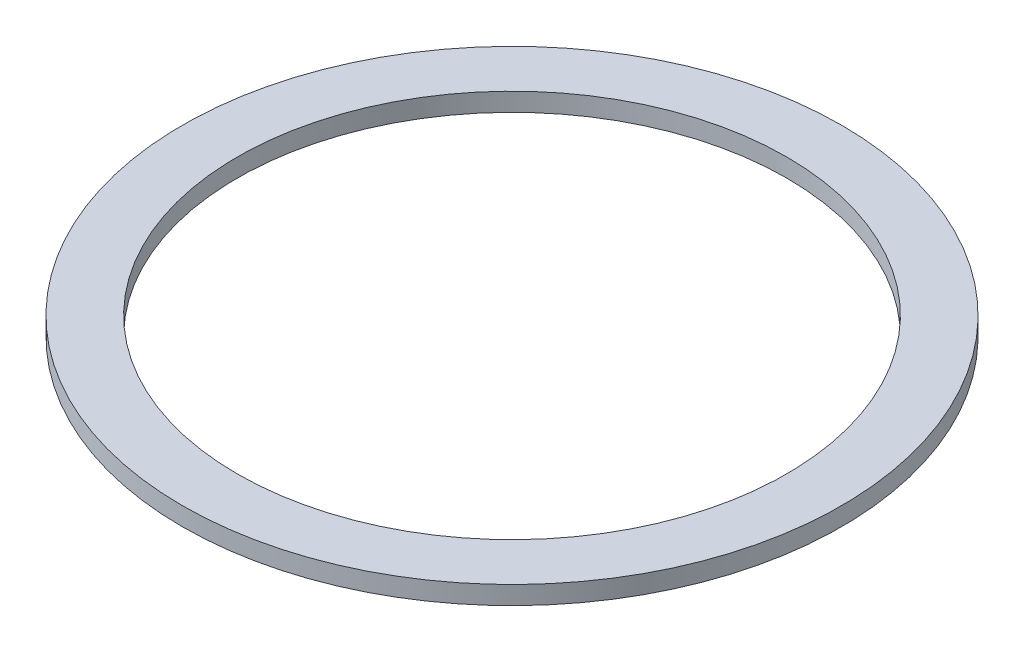
ISO-10303-21;
HEADER;
FILE_DESCRIPTION(('STEP AP214'),'2;1');
FILE_NAME('part.step','',(''),(''),'','','');
FILE_SCHEMA(('AUTOMOTIVE_DESIGN { 1 0 10303 214 1 1 1 1 }'));
ENDSEC;
DATA;
#1=APPLICATION_CONTEXT('core data for automotive mechanical design processes');
#2=APPLICATION_PROTOCOL_DEFINITION('international standard','automotive_design',2000,#1);
#3=PRODUCT_CONTEXT('',#1,'mechanical');
#4=PRODUCT('Part','Part','',(#3));
#5=PRODUCT_RELATED_PRODUCT_CATEGORY('part','',(#4));
#6=PRODUCT_DEFINITION_FORMATION('','',#4);
#7=PRODUCT_DEFINITION_CONTEXT('part definition',#1,'design');
#8=PRODUCT_DEFINITION('design','',#6,#7);
#9=PRODUCT_DEFINITION_SHAPE('','',#8);
#10=(LENGTH_UNIT() NAMED_UNIT(*) SI_UNIT(.MILLI.,.METRE.));
#11=(NAMED_UNIT(*) PLANE_ANGLE_UNIT() SI_UNIT($,.RADIAN.));
#12=(NAMED_UNIT(*) SI_UNIT($,.STERADIAN.) SOLID_ANGLE_UNIT());
#13=UNCERTAINTY_MEASURE_WITH_UNIT(LENGTH_MEASURE(1.E-05),#10,'distance_accuracy_value','');
#14=(GEOMETRIC_REPRESENTATION_CONTEXT(3) GLOBAL_UNCERTAINTY_ASSIGNED_CONTEXT((#13)) GLOBAL_UNIT_ASSIGNED_CONTEXT((#10,
#11,#12)) REPRESENTATION_CONTEXT('',''));
#15=CARTESIAN_POINT('',(0.,0.,0.));
#16=DIRECTION('',(0.,0.,1.));
#17=DIRECTION('',(1.,0.,0.));
#18=AXIS2_PLACEMENT_3D('',#15,#16,#17);
#19=CARTESIAN_POINT('',(0.,5.,0.));
#20=DIRECTION('',(0.,1.,0.));
#21=DIRECTION('',(0.,0.,1.));
#22=AXIS2_PLACEMENT_3D('',#19,#20,#21);
#23=PLANE('',#22);
#24=CARTESIAN_POINT('',(0.,5.,0.));
#25=DIRECTION('',(0.,1.,0.));
#26=DIRECTION('',(0.,0.,1.));
#27=AXIS2_PLACEMENT_3D('',#24,#25,#26);
#28=CIRCLE('',#27,180.);
#29=CARTESIAN_POINT('',(0.,5.,180.));
#30=VERTEX_POINT('',#29);
#31=EDGE_CURVE('E10',#30,#30,#28,.T.);
#32=ORIENTED_EDGE('',*,*,#31,.T.);
#33=EDGE_LOOP('',(#32));
#34=FACE_BOUND('',#33,.T.);
#35=CARTESIAN_POINT('',(0.,5.,0.));
#36=DIRECTION('',(0.,1.,0.));
#37=DIRECTION('',(0.,0.,1.));
#38=AXIS2_PLACEMENT_3D('',#35,#36,#37);
#39=CIRCLE('',#38,150.);
#40=CARTESIAN_POINT('',(0.,5.,150.));
#41=VERTEX_POINT('',#40);
#42=EDGE_CURVE('E42',#41,#41,#39,.T.);
#43=ORIENTED_EDGE('',*,*,#42,.F.);
#44=EDGE_LOOP('',(#43));
#45=FACE_BOUND('',#44,.T.);
#46=ADVANCED_FACE('F31',(#34,#45),#23,.T.);
#47=CARTESIAN_POINT('',(0.,-5.,0.));
#48=DIRECTION('',(0.,1.,0.));
#49=DIRECTION('',(0.,0.,1.));
#50=AXIS2_PLACEMENT_3D('',#47,#48,#49);
#51=PLANE('',#50);
#52=CARTESIAN_POINT('',(0.,-5.,0.));
#53=DIRECTION('',(0.,1.,0.));
#54=DIRECTION('',(0.,0.,1.));
#55=AXIS2_PLACEMENT_3D('',#52,#53,#54);
#56=CIRCLE('',#55,180.);
#57=CARTESIAN_POINT('',(0.,-5.,180.));
#58=VERTEX_POINT('',#57);
#59=EDGE_CURVE('E35',#58,#58,#56,.T.);
#60=ORIENTED_EDGE('',*,*,#59,.F.);
#61=EDGE_LOOP('',(#60));
#62=FACE_BOUND('',#61,.T.);
#63=CARTESIAN_POINT('',(0.,-5.,0.));
#64=DIRECTION('',(0.,1.,0.));
#65=DIRECTION('',(0.,0.,1.));
#66=AXIS2_PLACEMENT_3D('',#63,#64,#65);
#67=CIRCLE('',#66,150.);
#68=CARTESIAN_POINT('',(0.,-5.,150.));
#69=VERTEX_POINT('',#68);
#70=EDGE_CURVE('E44',#69,#69,#67,.T.);
#71=ORIENTED_EDGE('',*,*,#70,.T.);
#72=EDGE_LOOP('',(#71));
#73=FACE_BOUND('',#72,.T.);
#74=ADVANCED_FACE('F54',(#62,#73),#51,.F.);
#75=CARTESIAN_POINT('',(0.,5.,0.));
#76=DIRECTION('',(0.,-1.,0.));
#77=DIRECTION('',(0.,0.,-1.));
#78=AXIS2_PLACEMENT_3D('',#75,#76,#77);
#79=CYLINDRICAL_SURFACE('',#78,180.);
#80=ORIENTED_EDGE('',*,*,#31,.F.);
#81=EDGE_LOOP('',(#80));
#82=FACE_BOUND('',#81,.T.);
#83=ORIENTED_EDGE('',*,*,#59,.T.);
#84=EDGE_LOOP('',(#83));
#85=FACE_BOUND('',#84,.T.);
#86=ADVANCED_FACE('F33',(#82,#85),#79,.T.);
#87=CARTESIAN_POINT('',(0.,5.,0.));
#88=DIRECTION('',(0.,-1.,0.));
#89=DIRECTION('',(0.,0.,-1.));
#90=AXIS2_PLACEMENT_3D('',#87,#88,#89);
#91=CYLINDRICAL_SURFACE('',#90,150.);
#92=ORIENTED_EDGE('',*,*,#42,.T.);
#93=EDGE_LOOP('',(#92));
#94=FACE_BOUND('',#93,.T.);
#95=ORIENTED_EDGE('',*,*,#70,.F.);
#96=EDGE_LOOP('',(#95));
#97=FACE_BOUND('',#96,.T.);
#98=ADVANCED_FACE('F50',(#94,#97),#91,.F.);
#99=CLOSED_SHELL('',(#46,#74,#86,#98));
#100=MANIFOLD_SOLID_BREP('B2',#99);
#101=ADVANCED_BREP_SHAPE_REPRESENTATION('',(#18,#100),#14);
#102=SHAPE_DEFINITION_REPRESENTATION(#9,#101);
ENDSEC;
END-ISO-10303-21;
